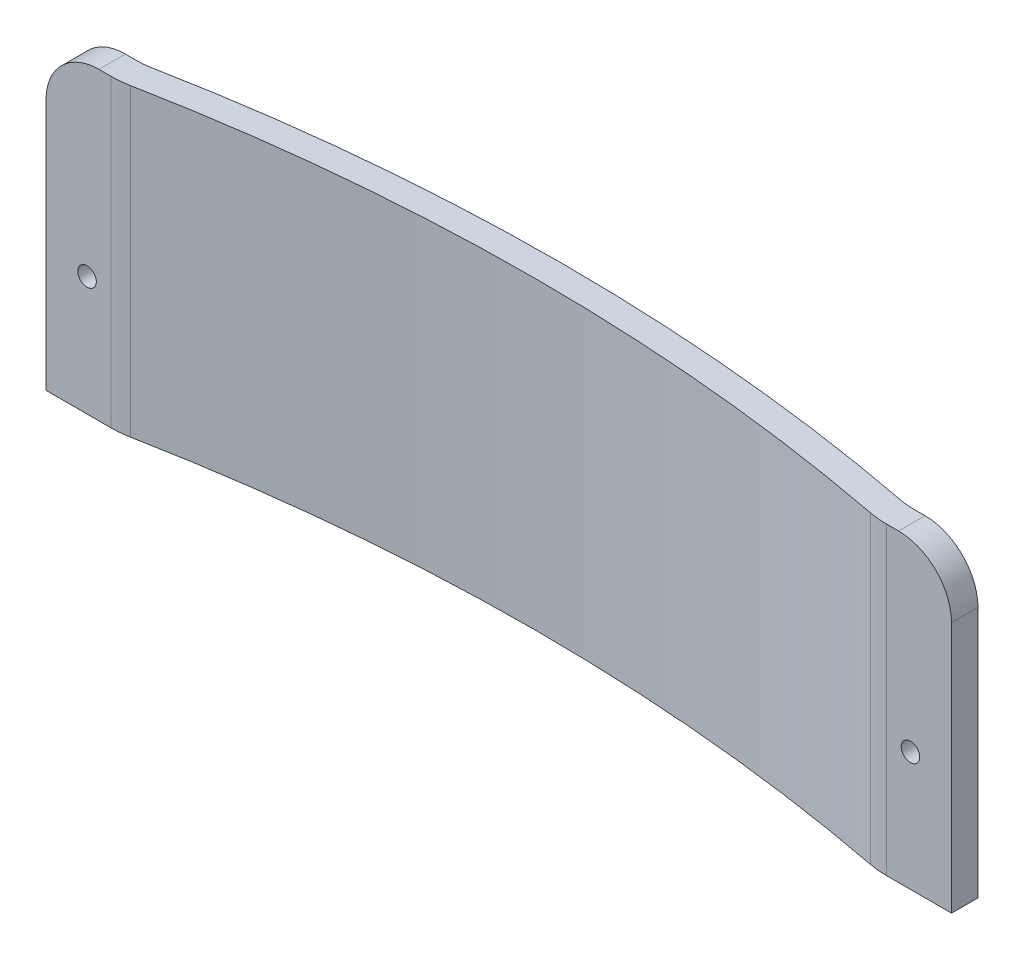
ISO-10303-21;
HEADER;
FILE_DESCRIPTION(('STEP AP214'),'2;1');
FILE_NAME('part.step','',(''),(''),'','','');
FILE_SCHEMA(('AUTOMOTIVE_DESIGN { 1 0 10303 214 1 1 1 1 }'));
ENDSEC;
DATA;
#1=APPLICATION_CONTEXT('core data for automotive mechanical design processes');
#2=APPLICATION_PROTOCOL_DEFINITION('international standard','automotive_design',2000,#1);
#3=PRODUCT_CONTEXT('',#1,'mechanical');
#4=PRODUCT('Part','Part','',(#3));
#5=PRODUCT_RELATED_PRODUCT_CATEGORY('part','',(#4));
#6=PRODUCT_DEFINITION_FORMATION('','',#4);
#7=PRODUCT_DEFINITION_CONTEXT('part definition',#1,'design');
#8=PRODUCT_DEFINITION('design','',#6,#7);
#9=PRODUCT_DEFINITION_SHAPE('','',#8);
#10=(LENGTH_UNIT() NAMED_UNIT(*) SI_UNIT(.MILLI.,.METRE.));
#11=(NAMED_UNIT(*) PLANE_ANGLE_UNIT() SI_UNIT($,.RADIAN.));
#12=(NAMED_UNIT(*) SI_UNIT($,.STERADIAN.) SOLID_ANGLE_UNIT());
#13=UNCERTAINTY_MEASURE_WITH_UNIT(LENGTH_MEASURE(1.E-05),#10,'distance_accuracy_value','');
#14=(GEOMETRIC_REPRESENTATION_CONTEXT(3) GLOBAL_UNCERTAINTY_ASSIGNED_CONTEXT((#13)) GLOBAL_UNIT_ASSIGNED_CONTEXT((#10,
#11,#12)) REPRESENTATION_CONTEXT('',''));
#15=CARTESIAN_POINT('',(0.,0.,0.));
#16=DIRECTION('',(0.,0.,1.));
#17=DIRECTION('',(1.,0.,0.));
#18=AXIS2_PLACEMENT_3D('',#15,#16,#17);
#19=CARTESIAN_POINT('',(-171.,115.,-10.));
#20=DIRECTION('',(0.,0.,1.));
#21=DIRECTION('',(1.,0.,0.));
#22=AXIS2_PLACEMENT_3D('',#19,#20,#21);
#23=PLANE('',#22);
#24=CARTESIAN_POINT('',(-155.5,45.,-10.));
#25=DIRECTION('',(0.,0.,1.));
#26=DIRECTION('',(1.,0.,0.));
#27=AXIS2_PLACEMENT_3D('',#24,#25,#26);
#28=CIRCLE('',#27,3.49999999999999);
#29=CARTESIAN_POINT('',(-152.,45.,-10.));
#30=VERTEX_POINT('',#29);
#31=EDGE_CURVE('E187',#30,#30,#28,.T.);
#32=ORIENTED_EDGE('',*,*,#31,.T.);
#33=EDGE_LOOP('',(#32));
#34=FACE_BOUND('',#33,.T.);
#35=DIRECTION('',(0.,-1.,0.));
#36=VECTOR('',#35,1.);
#37=CARTESIAN_POINT('',(-171.,115.,-10.));
#38=LINE('',#37,#36);
#39=CARTESIAN_POINT('',(-171.,95.,-10.));
#40=VERTEX_POINT('',#39);
#41=CARTESIAN_POINT('',(-171.,0.,-10.));
#42=VERTEX_POINT('',#41);
#43=EDGE_CURVE('E234',#40,#42,#38,.T.);
#44=ORIENTED_EDGE('',*,*,#43,.F.);
#45=CARTESIAN_POINT('',(-151.,95.,-10.));
#46=DIRECTION('',(0.,0.,1.));
#47=DIRECTION('',(1.,0.,0.));
#48=AXIS2_PLACEMENT_3D('',#45,#46,#47);
#49=CIRCLE('',#48,20.);
#50=CARTESIAN_POINT('',(-151.,115.,-10.));
#51=VERTEX_POINT('',#50);
#52=EDGE_CURVE('E244',#40,#51,#49,.F.);
#53=ORIENTED_EDGE('',*,*,#52,.T.);
#54=DIRECTION('',(1.,0.,0.));
#55=VECTOR('',#54,1.);
#56=CARTESIAN_POINT('',(-171.,115.,-10.));
#57=LINE('',#56,#55);
#58=CARTESIAN_POINT('',(-146.383337508188,115.,-10.));
#59=VERTEX_POINT('',#58);
#60=EDGE_CURVE('E161',#59,#51,#57,.F.);
#61=ORIENTED_EDGE('',*,*,#60,.F.);
#62=DIRECTION('',(0.,-1.,0.));
#63=VECTOR('',#62,1.);
#64=CARTESIAN_POINT('',(-146.383337508188,115.,-10.));
#65=LINE('',#64,#63);
#66=CARTESIAN_POINT('',(-146.383337508188,0.,-10.));
#67=VERTEX_POINT('',#66);
#68=EDGE_CURVE('E182',#59,#67,#65,.T.);
#69=ORIENTED_EDGE('',*,*,#68,.T.);
#70=DIRECTION('',(1.,0.,0.));
#71=VECTOR('',#70,1.);
#72=CARTESIAN_POINT('',(-171.,0.,-10.));
#73=LINE('',#72,#71);
#74=EDGE_CURVE('E183',#67,#42,#73,.F.);
#75=ORIENTED_EDGE('',*,*,#74,.T.);
#76=EDGE_LOOP('',(#44,#53,#61,#69,#75));
#77=FACE_BOUND('',#76,.T.);
#78=ADVANCED_FACE('F38',(#34,#77),#23,.F.);
#79=CARTESIAN_POINT('',(-171.,115.,0.));
#80=DIRECTION('',(-1.,0.,0.));
#81=DIRECTION('',(0.,0.,1.));
#82=AXIS2_PLACEMENT_3D('',#79,#80,#81);
#83=PLANE('',#82);
#84=DIRECTION('',(0.,-1.,0.));
#85=VECTOR('',#84,1.);
#86=CARTESIAN_POINT('',(-171.,115.,0.));
#87=LINE('',#86,#85);
#88=CARTESIAN_POINT('',(-171.,95.,0.));
#89=VERTEX_POINT('',#88);
#90=CARTESIAN_POINT('',(-171.,0.,0.));
#91=VERTEX_POINT('',#90);
#92=EDGE_CURVE('E149',#89,#91,#87,.T.);
#93=ORIENTED_EDGE('',*,*,#92,.F.);
#94=DIRECTION('',(0.,0.,-1.));
#95=VECTOR('',#94,1.);
#96=CARTESIAN_POINT('',(-171.,95.,-10.));
#97=LINE('',#96,#95);
#98=EDGE_CURVE('E236',#89,#40,#97,.T.);
#99=ORIENTED_EDGE('',*,*,#98,.T.);
#100=ORIENTED_EDGE('',*,*,#43,.T.);
#101=DIRECTION('',(0.,0.,-1.));
#102=VECTOR('',#101,1.);
#103=CARTESIAN_POINT('',(-171.,0.,0.));
#104=LINE('',#103,#102);
#105=EDGE_CURVE('E186',#91,#42,#104,.T.);
#106=ORIENTED_EDGE('',*,*,#105,.F.);
#107=EDGE_LOOP('',(#93,#99,#100,#106));
#108=FACE_BOUND('',#107,.T.);
#109=ADVANCED_FACE('F309',(#108),#83,.T.);
#110=CARTESIAN_POINT('',(-171.,115.,0.));
#111=DIRECTION('',(0.,0.,1.));
#112=DIRECTION('',(1.,0.,0.));
#113=AXIS2_PLACEMENT_3D('',#110,#111,#112);
#114=PLANE('',#113);
#115=CARTESIAN_POINT('',(-155.5,45.,0.));
#116=DIRECTION('',(0.,0.,1.));
#117=DIRECTION('',(1.,0.,0.));
#118=AXIS2_PLACEMENT_3D('',#115,#116,#117);
#119=CIRCLE('',#118,3.49999999999999);
#120=CARTESIAN_POINT('',(-152.,45.,0.));
#121=VERTEX_POINT('',#120);
#122=EDGE_CURVE('E240',#121,#121,#119,.T.);
#123=ORIENTED_EDGE('',*,*,#122,.F.);
#124=EDGE_LOOP('',(#123));
#125=FACE_BOUND('',#124,.T.);
#126=DIRECTION('',(-1.,0.,0.));
#127=VECTOR('',#126,1.);
#128=CARTESIAN_POINT('',(-171.,115.,0.));
#129=LINE('',#128,#127);
#130=CARTESIAN_POINT('',(-146.383337508188,115.,0.));
#131=VERTEX_POINT('',#130);
#132=CARTESIAN_POINT('',(-151.,115.,0.));
#133=VERTEX_POINT('',#132);
#134=EDGE_CURVE('E141',#131,#133,#129,.T.);
#135=ORIENTED_EDGE('',*,*,#134,.T.);
#136=CARTESIAN_POINT('',(-151.,95.,0.));
#137=DIRECTION('',(0.,0.,1.));
#138=DIRECTION('',(1.,0.,0.));
#139=AXIS2_PLACEMENT_3D('',#136,#137,#138);
#140=CIRCLE('',#139,20.);
#141=EDGE_CURVE('E249',#133,#89,#140,.T.);
#142=ORIENTED_EDGE('',*,*,#141,.T.);
#143=ORIENTED_EDGE('',*,*,#92,.T.);
#144=DIRECTION('',(-1.,0.,0.));
#145=VECTOR('',#144,1.);
#146=CARTESIAN_POINT('',(-171.,0.,0.));
#147=LINE('',#146,#145);
#148=CARTESIAN_POINT('',(-146.383337508188,0.,0.));
#149=VERTEX_POINT('',#148);
#150=EDGE_CURVE('E144',#149,#91,#147,.T.);
#151=ORIENTED_EDGE('',*,*,#150,.F.);
#152=DIRECTION('',(0.,-1.,0.));
#153=VECTOR('',#152,1.);
#154=CARTESIAN_POINT('',(-146.383337508188,115.,0.));
#155=LINE('',#154,#153);
#156=EDGE_CURVE('E138',#131,#149,#155,.T.);
#157=ORIENTED_EDGE('',*,*,#156,.F.);
#158=EDGE_LOOP('',(#135,#142,#143,#151,#157));
#159=FACE_BOUND('',#158,.T.);
#160=ADVANCED_FACE('F140',(#125,#159),#114,.T.);
#161=CARTESIAN_POINT('',(-146.383337508188,115.,-35.));
#162=DIRECTION('',(0.,-1.,0.));
#163=DIRECTION('',(0.,0.,-1.));
#164=AXIS2_PLACEMENT_3D('',#161,#162,#163);
#165=CYLINDRICAL_SURFACE('',#164,35.);
#166=CARTESIAN_POINT('',(-146.383337508188,0.,-35.));
#167=DIRECTION('',(0.,-1.,0.));
#168=DIRECTION('',(0.,0.,1.));
#169=AXIS2_PLACEMENT_3D('',#166,#167,#168);
#170=CIRCLE('',#169,35.);
#171=CARTESIAN_POINT('',(-139.755372679227,0.,-0.633299805974104));
#172=VERTEX_POINT('',#171);
#173=EDGE_CURVE('E191',#172,#149,#170,.T.);
#174=ORIENTED_EDGE('',*,*,#173,.F.);
#175=DIRECTION('',(0.,-1.,0.));
#176=VECTOR('',#175,1.);
#177=CARTESIAN_POINT('',(-139.755372679227,115.,-0.633299805974104));
#178=LINE('',#177,#176);
#179=CARTESIAN_POINT('',(-139.755372679227,115.,-0.633299805974104));
#180=VERTEX_POINT('',#179);
#181=EDGE_CURVE('E150',#180,#172,#178,.T.);
#182=ORIENTED_EDGE('',*,*,#181,.F.);
#183=CARTESIAN_POINT('',(-146.383337508188,115.,-35.));
#184=DIRECTION('',(0.,-1.,0.));
#185=DIRECTION('',(0.,0.,1.));
#186=AXIS2_PLACEMENT_3D('',#183,#184,#185);
#187=CIRCLE('',#186,35.);
#188=EDGE_CURVE('E157',#180,#131,#187,.T.);
#189=ORIENTED_EDGE('',*,*,#188,.T.);
#190=ORIENTED_EDGE('',*,*,#156,.T.);
#191=EDGE_LOOP('',(#174,#182,#189,#190));
#192=FACE_BOUND('',#191,.T.);
#193=ADVANCED_FACE('F163',(#192),#165,.T.);
#194=CARTESIAN_POINT('',(0.,115.,724.013121428058));
#195=DIRECTION('',(0.,-1.,0.));
#196=DIRECTION('',(0.,0.,-1.));
#197=AXIS2_PLACEMENT_3D('',#194,#195,#196);
#198=CYLINDRICAL_SURFACE('',#197,738.);
#199=CARTESIAN_POINT('',(0.,0.,724.013121428058));
#200=DIRECTION('',(0.,1.,0.));
#201=DIRECTION('',(0.,0.,-1.));
#202=AXIS2_PLACEMENT_3D('',#199,#200,#201);
#203=CIRCLE('',#202,738.);
#204=CARTESIAN_POINT('',(139.755372679227,0.,-0.633299805974263));
#205=VERTEX_POINT('',#204);
#206=EDGE_CURVE('E193',#205,#172,#203,.T.);
#207=ORIENTED_EDGE('',*,*,#206,.F.);
#208=DIRECTION('',(0.,-1.,0.));
#209=VECTOR('',#208,1.);
#210=CARTESIAN_POINT('',(139.755372679227,115.,-0.633299805974263));
#211=LINE('',#210,#209);
#212=CARTESIAN_POINT('',(139.755372679227,115.,-0.633299805974263));
#213=VERTEX_POINT('',#212);
#214=EDGE_CURVE('E230',#213,#205,#211,.T.);
#215=ORIENTED_EDGE('',*,*,#214,.F.);
#216=CARTESIAN_POINT('',(0.,115.,724.013121428058));
#217=DIRECTION('',(0.,1.,0.));
#218=DIRECTION('',(0.,0.,-1.));
#219=AXIS2_PLACEMENT_3D('',#216,#217,#218);
#220=CIRCLE('',#219,738.);
#221=EDGE_CURVE('E164',#213,#180,#220,.T.);
#222=ORIENTED_EDGE('',*,*,#221,.T.);
#223=ORIENTED_EDGE('',*,*,#181,.T.);
#224=EDGE_LOOP('',(#207,#215,#222,#223));
#225=FACE_BOUND('',#224,.T.);
#226=ADVANCED_FACE('F305',(#225),#198,.F.);
#227=CARTESIAN_POINT('',(146.383337508187,115.,-35.));
#228=DIRECTION('',(0.,-1.,0.));
#229=DIRECTION('',(0.,0.,-1.));
#230=AXIS2_PLACEMENT_3D('',#227,#228,#229);
#231=CYLINDRICAL_SURFACE('',#230,35.);
#232=CARTESIAN_POINT('',(146.383337508187,0.,-35.));
#233=DIRECTION('',(0.,-1.,0.));
#234=DIRECTION('',(0.,0.,-1.));
#235=AXIS2_PLACEMENT_3D('',#232,#233,#234);
#236=CIRCLE('',#235,35.);
#237=CARTESIAN_POINT('',(146.383337508187,0.,0.));
#238=VERTEX_POINT('',#237);
#239=EDGE_CURVE('E196',#238,#205,#236,.T.);
#240=ORIENTED_EDGE('',*,*,#239,.F.);
#241=DIRECTION('',(0.,-1.,0.));
#242=VECTOR('',#241,1.);
#243=CARTESIAN_POINT('',(146.383337508187,115.,0.));
#244=LINE('',#243,#242);
#245=CARTESIAN_POINT('',(146.383337508187,115.,0.));
#246=VERTEX_POINT('',#245);
#247=EDGE_CURVE('E228',#246,#238,#244,.T.);
#248=ORIENTED_EDGE('',*,*,#247,.F.);
#249=CARTESIAN_POINT('',(146.383337508187,115.,-35.));
#250=DIRECTION('',(0.,-1.,0.));
#251=DIRECTION('',(0.,0.,-1.));
#252=AXIS2_PLACEMENT_3D('',#249,#250,#251);
#253=CIRCLE('',#252,35.);
#254=EDGE_CURVE('E166',#246,#213,#253,.T.);
#255=ORIENTED_EDGE('',*,*,#254,.T.);
#256=ORIENTED_EDGE('',*,*,#214,.T.);
#257=EDGE_LOOP('',(#240,#248,#255,#256));
#258=FACE_BOUND('',#257,.T.);
#259=ADVANCED_FACE('F298',(#258),#231,.T.);
#260=CARTESIAN_POINT('',(171.,115.,0.));
#261=DIRECTION('',(0.,0.,1.));
#262=DIRECTION('',(1.,0.,0.));
#263=AXIS2_PLACEMENT_3D('',#260,#261,#262);
#264=PLANE('',#263);
#265=CARTESIAN_POINT('',(155.5,45.,0.));
#266=DIRECTION('',(0.,0.,1.));
#267=DIRECTION('',(1.,0.,0.));
#268=AXIS2_PLACEMENT_3D('',#265,#266,#267);
#269=CIRCLE('',#268,3.49999999999999);
#270=CARTESIAN_POINT('',(159.,45.,0.));
#271=VERTEX_POINT('',#270);
#272=EDGE_CURVE('E241',#271,#271,#269,.T.);
#273=ORIENTED_EDGE('',*,*,#272,.F.);
#274=EDGE_LOOP('',(#273));
#275=FACE_BOUND('',#274,.T.);
#276=DIRECTION('',(0.,-1.,0.));
#277=VECTOR('',#276,1.);
#278=CARTESIAN_POINT('',(171.,115.,0.));
#279=LINE('',#278,#277);
#280=CARTESIAN_POINT('',(171.,95.,0.));
#281=VERTEX_POINT('',#280);
#282=CARTESIAN_POINT('',(171.,0.,0.));
#283=VERTEX_POINT('',#282);
#284=EDGE_CURVE('E226',#281,#283,#279,.T.);
#285=ORIENTED_EDGE('',*,*,#284,.F.);
#286=CARTESIAN_POINT('',(151.,95.,0.));
#287=DIRECTION('',(0.,0.,1.));
#288=DIRECTION('',(1.,0.,0.));
#289=AXIS2_PLACEMENT_3D('',#286,#287,#288);
#290=CIRCLE('',#289,20.);
#291=CARTESIAN_POINT('',(151.,115.,0.));
#292=VERTEX_POINT('',#291);
#293=EDGE_CURVE('E46',#281,#292,#290,.T.);
#294=ORIENTED_EDGE('',*,*,#293,.T.);
#295=DIRECTION('',(-1.,0.,0.));
#296=VECTOR('',#295,1.);
#297=CARTESIAN_POINT('',(171.,115.,0.));
#298=LINE('',#297,#296);
#299=EDGE_CURVE('E172',#292,#246,#298,.T.);
#300=ORIENTED_EDGE('',*,*,#299,.T.);
#301=ORIENTED_EDGE('',*,*,#247,.T.);
#302=DIRECTION('',(-1.,0.,0.));
#303=VECTOR('',#302,1.);
#304=CARTESIAN_POINT('',(171.,0.,0.));
#305=LINE('',#304,#303);
#306=EDGE_CURVE('E199',#283,#238,#305,.T.);
#307=ORIENTED_EDGE('',*,*,#306,.F.);
#308=EDGE_LOOP('',(#285,#294,#300,#301,#307));
#309=FACE_BOUND('',#308,.T.);
#310=ADVANCED_FACE('F255',(#275,#309),#264,.T.);
#311=CARTESIAN_POINT('',(171.,115.,-10.));
#312=DIRECTION('',(1.,0.,0.));
#313=DIRECTION('',(0.,0.,-1.));
#314=AXIS2_PLACEMENT_3D('',#311,#312,#313);
#315=PLANE('',#314);
#316=DIRECTION('',(0.,-1.,0.));
#317=VECTOR('',#316,1.);
#318=CARTESIAN_POINT('',(171.,115.,-10.));
#319=LINE('',#318,#317);
#320=CARTESIAN_POINT('',(171.,95.,-10.));
#321=VERTEX_POINT('',#320);
#322=CARTESIAN_POINT('',(171.,0.,-10.));
#323=VERTEX_POINT('',#322);
#324=EDGE_CURVE('E224',#321,#323,#319,.T.);
#325=ORIENTED_EDGE('',*,*,#324,.F.);
#326=DIRECTION('',(0.,0.,1.));
#327=VECTOR('',#326,1.);
#328=CARTESIAN_POINT('',(171.,95.,0.));
#329=LINE('',#328,#327);
#330=EDGE_CURVE('E251',#321,#281,#329,.T.);
#331=ORIENTED_EDGE('',*,*,#330,.T.);
#332=ORIENTED_EDGE('',*,*,#284,.T.);
#333=DIRECTION('',(0.,0.,1.));
#334=VECTOR('',#333,1.);
#335=CARTESIAN_POINT('',(171.,0.,-10.));
#336=LINE('',#335,#334);
#337=EDGE_CURVE('E202',#323,#283,#336,.T.);
#338=ORIENTED_EDGE('',*,*,#337,.F.);
#339=EDGE_LOOP('',(#325,#331,#332,#338));
#340=FACE_BOUND('',#339,.T.);
#341=ADVANCED_FACE('F260',(#340),#315,.T.);
#342=CARTESIAN_POINT('',(171.,115.,-10.));
#343=DIRECTION('',(0.,0.,1.));
#344=DIRECTION('',(1.,0.,0.));
#345=AXIS2_PLACEMENT_3D('',#342,#343,#344);
#346=PLANE('',#345);
#347=CARTESIAN_POINT('',(155.5,45.,-10.));
#348=DIRECTION('',(0.,0.,1.));
#349=DIRECTION('',(1.,0.,0.));
#350=AXIS2_PLACEMENT_3D('',#347,#348,#349);
#351=CIRCLE('',#350,3.49999999999999);
#352=CARTESIAN_POINT('',(159.,45.,-10.));
#353=VERTEX_POINT('',#352);
#354=EDGE_CURVE('E237',#353,#353,#351,.T.);
#355=ORIENTED_EDGE('',*,*,#354,.T.);
#356=EDGE_LOOP('',(#355));
#357=FACE_BOUND('',#356,.T.);
#358=DIRECTION('',(1.,0.,0.));
#359=VECTOR('',#358,1.);
#360=CARTESIAN_POINT('',(171.,115.,-10.));
#361=LINE('',#360,#359);
#362=CARTESIAN_POINT('',(151.,115.,-10.));
#363=VERTEX_POINT('',#362);
#364=CARTESIAN_POINT('',(146.383337508187,115.,-10.));
#365=VERTEX_POINT('',#364);
#366=EDGE_CURVE('E174',#363,#365,#361,.F.);
#367=ORIENTED_EDGE('',*,*,#366,.F.);
#368=CARTESIAN_POINT('',(151.,95.,-10.));
#369=DIRECTION('',(0.,0.,1.));
#370=DIRECTION('',(1.,0.,0.));
#371=AXIS2_PLACEMENT_3D('',#368,#369,#370);
#372=CIRCLE('',#371,20.);
#373=EDGE_CURVE('E11',#363,#321,#372,.F.);
#374=ORIENTED_EDGE('',*,*,#373,.T.);
#375=ORIENTED_EDGE('',*,*,#324,.T.);
#376=DIRECTION('',(1.,0.,0.));
#377=VECTOR('',#376,1.);
#378=CARTESIAN_POINT('',(171.,0.,-10.));
#379=LINE('',#378,#377);
#380=CARTESIAN_POINT('',(146.383337508187,0.,-10.));
#381=VERTEX_POINT('',#380);
#382=EDGE_CURVE('E205',#323,#381,#379,.F.);
#383=ORIENTED_EDGE('',*,*,#382,.T.);
#384=DIRECTION('',(0.,-1.,0.));
#385=VECTOR('',#384,1.);
#386=CARTESIAN_POINT('',(146.383337508187,115.,-10.));
#387=LINE('',#386,#385);
#388=EDGE_CURVE('E221',#365,#381,#387,.T.);
#389=ORIENTED_EDGE('',*,*,#388,.F.);
#390=EDGE_LOOP('',(#367,#374,#375,#383,#389));
#391=FACE_BOUND('',#390,.T.);
#392=ADVANCED_FACE('F263',(#357,#391),#346,.F.);
#393=CARTESIAN_POINT('',(146.383337508187,115.,-35.));
#394=DIRECTION('',(0.,-1.,0.));
#395=DIRECTION('',(0.,0.,-1.));
#396=AXIS2_PLACEMENT_3D('',#393,#394,#395);
#397=CYLINDRICAL_SURFACE('',#396,25.);
#398=CARTESIAN_POINT('',(146.383337508187,0.,-35.));
#399=DIRECTION('',(0.,1.,0.));
#400=DIRECTION('',(1.,0.,0.));
#401=AXIS2_PLACEMENT_3D('',#398,#399,#400);
#402=CIRCLE('',#401,25.);
#403=CARTESIAN_POINT('',(141.649076916073,0.,-10.4523570042674));
#404=VERTEX_POINT('',#403);
#405=EDGE_CURVE('E207',#381,#404,#402,.F.);
#406=ORIENTED_EDGE('',*,*,#405,.T.);
#407=DIRECTION('',(0.,-1.,0.));
#408=VECTOR('',#407,1.);
#409=CARTESIAN_POINT('',(141.649076916073,115.,-10.4523570042674));
#410=LINE('',#409,#408);
#411=CARTESIAN_POINT('',(141.649076916073,115.,-10.4523570042674));
#412=VERTEX_POINT('',#411);
#413=EDGE_CURVE('E218',#412,#404,#410,.T.);
#414=ORIENTED_EDGE('',*,*,#413,.F.);
#415=CARTESIAN_POINT('',(146.383337508187,115.,-35.));
#416=DIRECTION('',(0.,1.,0.));
#417=DIRECTION('',(1.,0.,0.));
#418=AXIS2_PLACEMENT_3D('',#415,#416,#417);
#419=CIRCLE('',#418,25.);
#420=EDGE_CURVE('E176',#365,#412,#419,.F.);
#421=ORIENTED_EDGE('',*,*,#420,.F.);
#422=ORIENTED_EDGE('',*,*,#388,.T.);
#423=EDGE_LOOP('',(#406,#414,#421,#422));
#424=FACE_BOUND('',#423,.T.);
#425=ADVANCED_FACE('F273',(#424),#397,.F.);
#426=CARTESIAN_POINT('',(0.,115.,724.013121428058));
#427=DIRECTION('',(0.,-1.,0.));
#428=DIRECTION('',(0.,0.,-1.));
#429=AXIS2_PLACEMENT_3D('',#426,#427,#428);
#430=CYLINDRICAL_SURFACE('',#429,748.);
#431=CARTESIAN_POINT('',(0.,0.,724.013121428058));
#432=DIRECTION('',(0.,1.,0.));
#433=DIRECTION('',(1.,0.,0.));
#434=AXIS2_PLACEMENT_3D('',#431,#432,#433);
#435=CIRCLE('',#434,748.);
#436=CARTESIAN_POINT('',(-141.649076916073,0.,-10.4523570042672));
#437=VERTEX_POINT('',#436);
#438=EDGE_CURVE('E209',#404,#437,#435,.T.);
#439=ORIENTED_EDGE('',*,*,#438,.T.);
#440=DIRECTION('',(0.,-1.,0.));
#441=VECTOR('',#440,1.);
#442=CARTESIAN_POINT('',(-141.649076916073,115.,-10.4523570042672));
#443=LINE('',#442,#441);
#444=CARTESIAN_POINT('',(-141.649076916073,115.,-10.4523570042672));
#445=VERTEX_POINT('',#444);
#446=EDGE_CURVE('E215',#445,#437,#443,.T.);
#447=ORIENTED_EDGE('',*,*,#446,.F.);
#448=CARTESIAN_POINT('',(0.,115.,724.013121428058));
#449=DIRECTION('',(0.,1.,0.));
#450=DIRECTION('',(1.,0.,0.));
#451=AXIS2_PLACEMENT_3D('',#448,#449,#450);
#452=CIRCLE('',#451,748.);
#453=EDGE_CURVE('E178',#412,#445,#452,.T.);
#454=ORIENTED_EDGE('',*,*,#453,.F.);
#455=ORIENTED_EDGE('',*,*,#413,.T.);
#456=EDGE_LOOP('',(#439,#447,#454,#455));
#457=FACE_BOUND('',#456,.T.);
#458=ADVANCED_FACE('F277',(#457),#430,.T.);
#459=CARTESIAN_POINT('',(-146.383337508188,115.,-35.));
#460=DIRECTION('',(0.,-1.,0.));
#461=DIRECTION('',(0.,0.,-1.));
#462=AXIS2_PLACEMENT_3D('',#459,#460,#461);
#463=CYLINDRICAL_SURFACE('',#462,25.);
#464=CARTESIAN_POINT('',(-146.383337508188,0.,-35.));
#465=DIRECTION('',(0.,1.,0.));
#466=DIRECTION('',(1.,0.,0.));
#467=AXIS2_PLACEMENT_3D('',#464,#465,#466);
#468=CIRCLE('',#467,25.);
#469=EDGE_CURVE('E211',#437,#67,#468,.F.);
#470=ORIENTED_EDGE('',*,*,#469,.T.);
#471=ORIENTED_EDGE('',*,*,#68,.F.);
#472=CARTESIAN_POINT('',(-146.383337508188,115.,-35.));
#473=DIRECTION('',(0.,1.,0.));
#474=DIRECTION('',(1.,0.,0.));
#475=AXIS2_PLACEMENT_3D('',#472,#473,#474);
#476=CIRCLE('',#475,25.);
#477=EDGE_CURVE('E180',#445,#59,#476,.F.);
#478=ORIENTED_EDGE('',*,*,#477,.F.);
#479=ORIENTED_EDGE('',*,*,#446,.T.);
#480=EDGE_LOOP('',(#470,#471,#478,#479));
#481=FACE_BOUND('',#480,.T.);
#482=ADVANCED_FACE('F283',(#481),#463,.F.);
#483=CARTESIAN_POINT('',(-146.383337508188,115.,-35.));
#484=DIRECTION('',(0.,-1.,0.));
#485=DIRECTION('',(-1.,0.,0.));
#486=AXIS2_PLACEMENT_3D('',#483,#484,#485);
#487=PLANE('',#486);
#488=ORIENTED_EDGE('',*,*,#60,.T.);
#489=DIRECTION('',(0.,0.,-1.));
#490=VECTOR('',#489,1.);
#491=CARTESIAN_POINT('',(-151.,115.,0.));
#492=LINE('',#491,#490);
#493=EDGE_CURVE('E160',#51,#133,#492,.F.);
#494=ORIENTED_EDGE('',*,*,#493,.T.);
#495=ORIENTED_EDGE('',*,*,#134,.F.);
#496=ORIENTED_EDGE('',*,*,#188,.F.);
#497=ORIENTED_EDGE('',*,*,#221,.F.);
#498=ORIENTED_EDGE('',*,*,#254,.F.);
#499=ORIENTED_EDGE('',*,*,#299,.F.);
#500=DIRECTION('',(0.,0.,1.));
#501=VECTOR('',#500,1.);
#502=CARTESIAN_POINT('',(151.,115.,-10.));
#503=LINE('',#502,#501);
#504=EDGE_CURVE('E246',#292,#363,#503,.F.);
#505=ORIENTED_EDGE('',*,*,#504,.T.);
#506=ORIENTED_EDGE('',*,*,#366,.T.);
#507=ORIENTED_EDGE('',*,*,#420,.T.);
#508=ORIENTED_EDGE('',*,*,#453,.T.);
#509=ORIENTED_EDGE('',*,*,#477,.T.);
#510=EDGE_LOOP('',(#488,#494,#495,#496,#497,#498,#499,#505,#506,#507,#508,#509));
#511=FACE_BOUND('',#510,.T.);
#512=ADVANCED_FACE('F155',(#511),#487,.F.);
#513=CARTESIAN_POINT('',(-146.383337508188,0.,-35.));
#514=DIRECTION('',(0.,-1.,0.));
#515=DIRECTION('',(-1.,0.,0.));
#516=AXIS2_PLACEMENT_3D('',#513,#514,#515);
#517=PLANE('',#516);
#518=ORIENTED_EDGE('',*,*,#74,.F.);
#519=ORIENTED_EDGE('',*,*,#469,.F.);
#520=ORIENTED_EDGE('',*,*,#438,.F.);
#521=ORIENTED_EDGE('',*,*,#405,.F.);
#522=ORIENTED_EDGE('',*,*,#382,.F.);
#523=ORIENTED_EDGE('',*,*,#337,.T.);
#524=ORIENTED_EDGE('',*,*,#306,.T.);
#525=ORIENTED_EDGE('',*,*,#239,.T.);
#526=ORIENTED_EDGE('',*,*,#206,.T.);
#527=ORIENTED_EDGE('',*,*,#173,.T.);
#528=ORIENTED_EDGE('',*,*,#150,.T.);
#529=ORIENTED_EDGE('',*,*,#105,.T.);
#530=EDGE_LOOP('',(#518,#519,#520,#521,#522,#523,#524,#525,#526,#527,#528,#529));
#531=FACE_BOUND('',#530,.T.);
#532=ADVANCED_FACE('F268',(#531),#517,.T.);
#533=CARTESIAN_POINT('',(-155.5,45.,-23.986878571942));
#534=DIRECTION('',(0.,0.,1.));
#535=DIRECTION('',(1.,0.,0.));
#536=AXIS2_PLACEMENT_3D('',#533,#534,#535);
#537=CYLINDRICAL_SURFACE('',#536,3.49999999999999);
#538=CARTESIAN_POINT('',(-152.,45.,0.));
#539=CARTESIAN_POINT('',(-152.,45.,-0.10416666666667));
#540=CARTESIAN_POINT('',(-152.,45.,-0.208333333333337));
#541=CARTESIAN_POINT('',(-152.,45.,-0.416666666666671));
#542=CARTESIAN_POINT('',(-152.,45.,-0.520833333333337));
#543=CARTESIAN_POINT('',(-152.,45.,-0.729166666666671));
#544=CARTESIAN_POINT('',(-152.,45.,-0.833333333333337));
#545=CARTESIAN_POINT('',(-152.,45.,-1.04166666666667));
#546=CARTESIAN_POINT('',(-152.,45.,-1.14583333333334));
#547=CARTESIAN_POINT('',(-152.,45.,-1.35416666666667));
#548=CARTESIAN_POINT('',(-152.,45.,-1.45833333333334));
#549=CARTESIAN_POINT('',(-152.,45.,-1.66666666666667));
#550=CARTESIAN_POINT('',(-152.,45.,-1.77083333333334));
#551=CARTESIAN_POINT('',(-152.,45.,-1.97916666666667));
#552=CARTESIAN_POINT('',(-152.,45.,-2.08333333333334));
#553=CARTESIAN_POINT('',(-152.,45.,-2.29166666666667));
#554=CARTESIAN_POINT('',(-152.,45.,-2.39583333333334));
#555=CARTESIAN_POINT('',(-152.,45.,-2.60416666666667));
#556=CARTESIAN_POINT('',(-152.,45.,-2.70833333333334));
#557=CARTESIAN_POINT('',(-152.,45.,-2.91666666666667));
#558=CARTESIAN_POINT('',(-152.,45.,-3.02083333333334));
#559=CARTESIAN_POINT('',(-152.,45.,-3.22916666666667));
#560=CARTESIAN_POINT('',(-152.,45.,-3.33333333333334));
#561=CARTESIAN_POINT('',(-152.,45.,-3.54166666666667));
#562=CARTESIAN_POINT('',(-152.,45.,-3.64583333333334));
#563=CARTESIAN_POINT('',(-152.,45.,-3.85416666666667));
#564=CARTESIAN_POINT('',(-152.,45.,-3.95833333333334));
#565=CARTESIAN_POINT('',(-152.,45.,-4.16666666666667));
#566=CARTESIAN_POINT('',(-152.,45.,-4.27083333333334));
#567=CARTESIAN_POINT('',(-152.,45.,-4.47916666666667));
#568=CARTESIAN_POINT('',(-152.,45.,-4.58333333333333));
#569=CARTESIAN_POINT('',(-152.,45.,-4.79166666666667));
#570=CARTESIAN_POINT('',(-152.,45.,-4.89583333333333));
#571=CARTESIAN_POINT('',(-152.,45.,-5.10416666666667));
#572=CARTESIAN_POINT('',(-152.,45.,-5.20833333333333));
#573=CARTESIAN_POINT('',(-152.,45.,-5.41666666666667));
#574=CARTESIAN_POINT('',(-152.,45.,-5.52083333333333));
#575=CARTESIAN_POINT('',(-152.,45.,-5.72916666666667));
#576=CARTESIAN_POINT('',(-152.,45.,-5.83333333333334));
#577=CARTESIAN_POINT('',(-152.,45.,-6.04166666666667));
#578=CARTESIAN_POINT('',(-152.,45.,-6.14583333333334));
#579=CARTESIAN_POINT('',(-152.,45.,-6.35416666666667));
#580=CARTESIAN_POINT('',(-152.,45.,-6.45833333333334));
#581=CARTESIAN_POINT('',(-152.,45.,-6.66666666666667));
#582=CARTESIAN_POINT('',(-152.,45.,-6.77083333333334));
#583=CARTESIAN_POINT('',(-152.,45.,-6.97916666666667));
#584=CARTESIAN_POINT('',(-152.,45.,-7.08333333333334));
#585=CARTESIAN_POINT('',(-152.,45.,-7.29166666666667));
#586=CARTESIAN_POINT('',(-152.,45.,-7.39583333333334));
#587=CARTESIAN_POINT('',(-152.,45.,-7.60416666666667));
#588=CARTESIAN_POINT('',(-152.,45.,-7.70833333333334));
#589=CARTESIAN_POINT('',(-152.,45.,-7.91666666666667));
#590=CARTESIAN_POINT('',(-152.,45.,-8.02083333333334));
#591=CARTESIAN_POINT('',(-152.,45.,-8.22916666666667));
#592=CARTESIAN_POINT('',(-152.,45.,-8.33333333333334));
#593=CARTESIAN_POINT('',(-152.,45.,-8.54166666666667));
#594=CARTESIAN_POINT('',(-152.,45.,-8.64583333333333));
#595=CARTESIAN_POINT('',(-152.,45.,-8.85416666666667));
#596=CARTESIAN_POINT('',(-152.,45.,-8.95833333333333));
#597=CARTESIAN_POINT('',(-152.,45.,-9.16666666666667));
#598=CARTESIAN_POINT('',(-152.,45.,-9.27083333333333));
#599=CARTESIAN_POINT('',(-152.,45.,-9.47916666666667));
#600=CARTESIAN_POINT('',(-152.,45.,-9.58333333333333));
#601=CARTESIAN_POINT('',(-152.,45.,-9.79166666666667));
#602=CARTESIAN_POINT('',(-152.,45.,-9.89583333333333));
#603=CARTESIAN_POINT('',(-152.,45.,-10.));
#604=B_SPLINE_CURVE_WITH_KNOTS('',3,(#538,#539,#540,#541,#542,#543,#544,#545,#546,#547,#548,
#549,#550,#551,#552,#553,#554,#555,#556,#557,#558,#559,#560,#561,#562,#563,#564,#565,#566,#567,
#568,#569,#570,#571,#572,#573,#574,#575,#576,#577,#578,#579,#580,#581,#582,#583,#584,#585,#586,
#587,#588,#589,#590,#591,#592,#593,#594,#595,#596,#597,#598,#599,#600,#601,#602,#603),
.UNSPECIFIED.,.F.,.F.,(4,2,2,2,2,2,2,2,2,2,2,2,2,2,2,2,2,2,2,2,2,2,2,2,2,2,2,2,2,2,2,2,4),(0.,
0.3125,0.625000000000001,0.937500000000001,1.25,1.5625,1.875,2.1875,2.5,2.8125,3.125,3.4375,
3.75,4.0625,4.375,4.6875,5.,5.3125,5.625,5.9375,6.25,6.5625,6.875,7.1875,7.5,7.8125,8.125,
8.4375,8.75,9.0625,9.375,9.6875,10.),.UNSPECIFIED.);
#605=EDGE_CURVE('BSEAM325',#121,#30,#604,.T.);
#606=ORIENTED_EDGE('',*,*,#122,.T.);
#607=ORIENTED_EDGE('',*,*,#31,.F.);
#608=ORIENTED_EDGE('',*,*,#605,.T.);
#609=ORIENTED_EDGE('',*,*,#605,.F.);
#610=EDGE_LOOP('',(#606,#608,#607,#609));
#611=FACE_BOUND('',#610,.T.);
#612=ADVANCED_FACE('F325',(#611),#537,.F.);
#613=CARTESIAN_POINT('',(155.5,45.,-23.986878571942));
#614=DIRECTION('',(0.,0.,1.));
#615=DIRECTION('',(1.,0.,0.));
#616=AXIS2_PLACEMENT_3D('',#613,#614,#615);
#617=CYLINDRICAL_SURFACE('',#616,3.49999999999999);
#618=CARTESIAN_POINT('',(159.,45.,0.));
#619=CARTESIAN_POINT('',(159.,45.,-0.10416666666667));
#620=CARTESIAN_POINT('',(159.,45.,-0.208333333333337));
#621=CARTESIAN_POINT('',(159.,45.,-0.416666666666671));
#622=CARTESIAN_POINT('',(159.,45.,-0.520833333333337));
#623=CARTESIAN_POINT('',(159.,45.,-0.729166666666671));
#624=CARTESIAN_POINT('',(159.,45.,-0.833333333333337));
#625=CARTESIAN_POINT('',(159.,45.,-1.04166666666667));
#626=CARTESIAN_POINT('',(159.,45.,-1.14583333333334));
#627=CARTESIAN_POINT('',(159.,45.,-1.35416666666667));
#628=CARTESIAN_POINT('',(159.,45.,-1.45833333333334));
#629=CARTESIAN_POINT('',(159.,45.,-1.66666666666667));
#630=CARTESIAN_POINT('',(159.,45.,-1.77083333333334));
#631=CARTESIAN_POINT('',(159.,45.,-1.97916666666667));
#632=CARTESIAN_POINT('',(159.,45.,-2.08333333333334));
#633=CARTESIAN_POINT('',(159.,45.,-2.29166666666667));
#634=CARTESIAN_POINT('',(159.,45.,-2.39583333333334));
#635=CARTESIAN_POINT('',(159.,45.,-2.60416666666667));
#636=CARTESIAN_POINT('',(159.,45.,-2.70833333333334));
#637=CARTESIAN_POINT('',(159.,45.,-2.91666666666667));
#638=CARTESIAN_POINT('',(159.,45.,-3.02083333333334));
#639=CARTESIAN_POINT('',(159.,45.,-3.22916666666667));
#640=CARTESIAN_POINT('',(159.,45.,-3.33333333333334));
#641=CARTESIAN_POINT('',(159.,45.,-3.54166666666667));
#642=CARTESIAN_POINT('',(159.,45.,-3.64583333333334));
#643=CARTESIAN_POINT('',(159.,45.,-3.85416666666667));
#644=CARTESIAN_POINT('',(159.,45.,-3.95833333333334));
#645=CARTESIAN_POINT('',(159.,45.,-4.16666666666667));
#646=CARTESIAN_POINT('',(159.,45.,-4.27083333333334));
#647=CARTESIAN_POINT('',(159.,45.,-4.47916666666667));
#648=CARTESIAN_POINT('',(159.,45.,-4.58333333333333));
#649=CARTESIAN_POINT('',(159.,45.,-4.79166666666667));
#650=CARTESIAN_POINT('',(159.,45.,-4.89583333333333));
#651=CARTESIAN_POINT('',(159.,45.,-5.10416666666667));
#652=CARTESIAN_POINT('',(159.,45.,-5.20833333333333));
#653=CARTESIAN_POINT('',(159.,45.,-5.41666666666667));
#654=CARTESIAN_POINT('',(159.,45.,-5.52083333333333));
#655=CARTESIAN_POINT('',(159.,45.,-5.72916666666667));
#656=CARTESIAN_POINT('',(159.,45.,-5.83333333333334));
#657=CARTESIAN_POINT('',(159.,45.,-6.04166666666667));
#658=CARTESIAN_POINT('',(159.,45.,-6.14583333333334));
#659=CARTESIAN_POINT('',(159.,45.,-6.35416666666667));
#660=CARTESIAN_POINT('',(159.,45.,-6.45833333333334));
#661=CARTESIAN_POINT('',(159.,45.,-6.66666666666667));
#662=CARTESIAN_POINT('',(159.,45.,-6.77083333333334));
#663=CARTESIAN_POINT('',(159.,45.,-6.97916666666667));
#664=CARTESIAN_POINT('',(159.,45.,-7.08333333333334));
#665=CARTESIAN_POINT('',(159.,45.,-7.29166666666667));
#666=CARTESIAN_POINT('',(159.,45.,-7.39583333333334));
#667=CARTESIAN_POINT('',(159.,45.,-7.60416666666667));
#668=CARTESIAN_POINT('',(159.,45.,-7.70833333333334));
#669=CARTESIAN_POINT('',(159.,45.,-7.91666666666667));
#670=CARTESIAN_POINT('',(159.,45.,-8.02083333333334));
#671=CARTESIAN_POINT('',(159.,45.,-8.22916666666667));
#672=CARTESIAN_POINT('',(159.,45.,-8.33333333333334));
#673=CARTESIAN_POINT('',(159.,45.,-8.54166666666667));
#674=CARTESIAN_POINT('',(159.,45.,-8.64583333333333));
#675=CARTESIAN_POINT('',(159.,45.,-8.85416666666667));
#676=CARTESIAN_POINT('',(159.,45.,-8.95833333333333));
#677=CARTESIAN_POINT('',(159.,45.,-9.16666666666667));
#678=CARTESIAN_POINT('',(159.,45.,-9.27083333333333));
#679=CARTESIAN_POINT('',(159.,45.,-9.47916666666667));
#680=CARTESIAN_POINT('',(159.,45.,-9.58333333333333));
#681=CARTESIAN_POINT('',(159.,45.,-9.79166666666667));
#682=CARTESIAN_POINT('',(159.,45.,-9.89583333333333));
#683=CARTESIAN_POINT('',(159.,45.,-10.));
#684=B_SPLINE_CURVE_WITH_KNOTS('',3,(#618,#619,#620,#621,#622,#623,#624,#625,#626,#627,#628,
#629,#630,#631,#632,#633,#634,#635,#636,#637,#638,#639,#640,#641,#642,#643,#644,#645,#646,#647,
#648,#649,#650,#651,#652,#653,#654,#655,#656,#657,#658,#659,#660,#661,#662,#663,#664,#665,#666,
#667,#668,#669,#670,#671,#672,#673,#674,#675,#676,#677,#678,#679,#680,#681,#682,#683),
.UNSPECIFIED.,.F.,.F.,(4,2,2,2,2,2,2,2,2,2,2,2,2,2,2,2,2,2,2,2,2,2,2,2,2,2,2,2,2,2,2,2,4),(0.,
0.3125,0.625000000000001,0.937500000000001,1.25,1.5625,1.875,2.1875,2.5,2.8125,3.125,3.4375,
3.75,4.0625,4.375,4.6875,5.,5.3125,5.625,5.9375,6.25,6.5625,6.875,7.1875,7.5,7.8125,8.125,
8.4375,8.75,9.0625,9.375,9.6875,10.),.UNSPECIFIED.);
#685=EDGE_CURVE('BSEAM294',#271,#353,#684,.T.);
#686=ORIENTED_EDGE('',*,*,#272,.T.);
#687=ORIENTED_EDGE('',*,*,#354,.F.);
#688=ORIENTED_EDGE('',*,*,#685,.T.);
#689=ORIENTED_EDGE('',*,*,#685,.F.);
#690=EDGE_LOOP('',(#686,#688,#687,#689));
#691=FACE_BOUND('',#690,.T.);
#692=ADVANCED_FACE('F294',(#691),#617,.F.);
#693=CARTESIAN_POINT('',(-151.,95.,0.));
#694=DIRECTION('',(0.,0.,1.));
#695=DIRECTION('',(1.,0.,0.));
#696=AXIS2_PLACEMENT_3D('',#693,#694,#695);
#697=CYLINDRICAL_SURFACE('',#696,20.);
#698=ORIENTED_EDGE('',*,*,#141,.F.);
#699=ORIENTED_EDGE('',*,*,#493,.F.);
#700=ORIENTED_EDGE('',*,*,#52,.F.);
#701=ORIENTED_EDGE('',*,*,#98,.F.);
#702=EDGE_LOOP('',(#698,#699,#700,#701));
#703=FACE_BOUND('',#702,.T.);
#704=ADVANCED_FACE('F318',(#703),#697,.T.);
#705=CARTESIAN_POINT('',(151.,95.,-10.));
#706=DIRECTION('',(0.,0.,-1.));
#707=DIRECTION('',(-1.,0.,0.));
#708=AXIS2_PLACEMENT_3D('',#705,#706,#707);
#709=CYLINDRICAL_SURFACE('',#708,20.);
#710=ORIENTED_EDGE('',*,*,#373,.F.);
#711=ORIENTED_EDGE('',*,*,#504,.F.);
#712=ORIENTED_EDGE('',*,*,#293,.F.);
#713=ORIENTED_EDGE('',*,*,#330,.F.);
#714=EDGE_LOOP('',(#710,#711,#712,#713));
#715=FACE_BOUND('',#714,.T.);
#716=ADVANCED_FACE('F40',(#715),#709,.T.);
#717=CLOSED_SHELL('',(#78,#109,#160,#193,#226,#259,#310,#341,#392,#425,#458,#482,#512,#532,#612,
#692,#704,#716));
#718=MANIFOLD_SOLID_BREP('B2',#717);
#719=ADVANCED_BREP_SHAPE_REPRESENTATION('',(#18,#718),#14);
#720=SHAPE_DEFINITION_REPRESENTATION(#9,#719);
ENDSEC;
END-ISO-10303-21;
